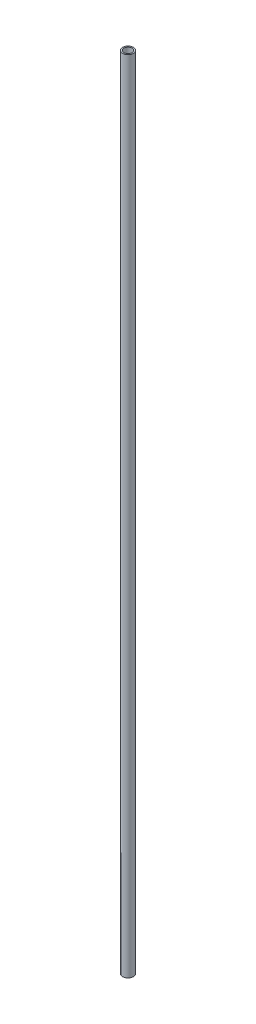
ISO-10303-21;
HEADER;
FILE_DESCRIPTION(('STEP AP214'),'2;1');
FILE_NAME('part.step','',(''),(''),'','','');
FILE_SCHEMA(('AUTOMOTIVE_DESIGN { 1 0 10303 214 1 1 1 1 }'));
ENDSEC;
DATA;
#1=APPLICATION_CONTEXT('core data for automotive mechanical design processes');
#2=APPLICATION_PROTOCOL_DEFINITION('international standard','automotive_design',2000,#1);
#3=PRODUCT_CONTEXT('',#1,'mechanical');
#4=PRODUCT('Part','Part','',(#3));
#5=PRODUCT_RELATED_PRODUCT_CATEGORY('part','',(#4));
#6=PRODUCT_DEFINITION_FORMATION('','',#4);
#7=PRODUCT_DEFINITION_CONTEXT('part definition',#1,'design');
#8=PRODUCT_DEFINITION('design','',#6,#7);
#9=PRODUCT_DEFINITION_SHAPE('','',#8);
#10=(LENGTH_UNIT() NAMED_UNIT(*) SI_UNIT(.MILLI.,.METRE.));
#11=(NAMED_UNIT(*) PLANE_ANGLE_UNIT() SI_UNIT($,.RADIAN.));
#12=(NAMED_UNIT(*) SI_UNIT($,.STERADIAN.) SOLID_ANGLE_UNIT());
#13=UNCERTAINTY_MEASURE_WITH_UNIT(LENGTH_MEASURE(1.E-05),#10,'distance_accuracy_value','');
#14=(GEOMETRIC_REPRESENTATION_CONTEXT(3) GLOBAL_UNCERTAINTY_ASSIGNED_CONTEXT((#13)) GLOBAL_UNIT_ASSIGNED_CONTEXT((#10,
#11,#12)) REPRESENTATION_CONTEXT('',''));
#15=CARTESIAN_POINT('',(0.,0.,0.));
#16=DIRECTION('',(0.,0.,1.));
#17=DIRECTION('',(1.,0.,0.));
#18=AXIS2_PLACEMENT_3D('',#15,#16,#17);
#19=CARTESIAN_POINT('',(0.,-300.,0.));
#20=DIRECTION('',(0.,1.,0.));
#21=DIRECTION('',(0.,0.,1.));
#22=AXIS2_PLACEMENT_3D('',#19,#20,#21);
#23=CYLINDRICAL_SURFACE('',#22,4.);
#24=CARTESIAN_POINT('',(0.,-300.,0.));
#25=DIRECTION('',(0.,1.,0.));
#26=DIRECTION('',(0.,0.,1.));
#27=AXIS2_PLACEMENT_3D('',#24,#25,#26);
#28=CIRCLE('',#27,4.);
#29=CARTESIAN_POINT('',(0.,-300.,4.));
#30=VERTEX_POINT('',#29);
#31=EDGE_CURVE('E10',#30,#30,#28,.T.);
#32=ORIENTED_EDGE('',*,*,#31,.T.);
#33=EDGE_LOOP('',(#32));
#34=FACE_BOUND('',#33,.T.);
#35=CARTESIAN_POINT('',(0.,300.,0.));
#36=DIRECTION('',(0.,1.,0.));
#37=DIRECTION('',(0.,0.,1.));
#38=AXIS2_PLACEMENT_3D('',#35,#36,#37);
#39=CIRCLE('',#38,4.);
#40=CARTESIAN_POINT('',(0.,300.,4.));
#41=VERTEX_POINT('',#40);
#42=EDGE_CURVE('E35',#41,#41,#39,.T.);
#43=ORIENTED_EDGE('',*,*,#42,.F.);
#44=EDGE_LOOP('',(#43));
#45=FACE_BOUND('',#44,.T.);
#46=ADVANCED_FACE('F32',(#34,#45),#23,.T.);
#47=CARTESIAN_POINT('',(0.,-300.,0.));
#48=DIRECTION('',(0.,1.,0.));
#49=DIRECTION('',(0.,0.,1.));
#50=AXIS2_PLACEMENT_3D('',#47,#48,#49);
#51=PLANE('',#50);
#52=CARTESIAN_POINT('',(0.,-300.,0.));
#53=DIRECTION('',(0.,1.,0.));
#54=DIRECTION('',(0.,0.,1.));
#55=AXIS2_PLACEMENT_3D('',#52,#53,#54);
#56=CIRCLE('',#55,3.);
#57=CARTESIAN_POINT('',(0.,-300.,3.));
#58=VERTEX_POINT('',#57);
#59=EDGE_CURVE('E42',#58,#58,#56,.T.);
#60=ORIENTED_EDGE('',*,*,#59,.T.);
#61=EDGE_LOOP('',(#60));
#62=FACE_BOUND('',#61,.T.);
#63=ORIENTED_EDGE('',*,*,#31,.F.);
#64=EDGE_LOOP('',(#63));
#65=FACE_BOUND('',#64,.T.);
#66=ADVANCED_FACE('F50',(#62,#65),#51,.F.);
#67=CARTESIAN_POINT('',(0.,300.,0.));
#68=DIRECTION('',(0.,1.,0.));
#69=DIRECTION('',(0.,0.,1.));
#70=AXIS2_PLACEMENT_3D('',#67,#68,#69);
#71=PLANE('',#70);
#72=CARTESIAN_POINT('',(0.,300.,0.));
#73=DIRECTION('',(0.,1.,0.));
#74=DIRECTION('',(0.,0.,1.));
#75=AXIS2_PLACEMENT_3D('',#72,#73,#74);
#76=CIRCLE('',#75,3.);
#77=CARTESIAN_POINT('',(0.,300.,3.));
#78=VERTEX_POINT('',#77);
#79=EDGE_CURVE('E44',#78,#78,#76,.T.);
#80=ORIENTED_EDGE('',*,*,#79,.F.);
#81=EDGE_LOOP('',(#80));
#82=FACE_BOUND('',#81,.T.);
#83=ORIENTED_EDGE('',*,*,#42,.T.);
#84=EDGE_LOOP('',(#83));
#85=FACE_BOUND('',#84,.T.);
#86=ADVANCED_FACE('F56',(#82,#85),#71,.T.);
#87=CARTESIAN_POINT('',(0.,-300.,0.));
#88=DIRECTION('',(0.,1.,0.));
#89=DIRECTION('',(0.,0.,1.));
#90=AXIS2_PLACEMENT_3D('',#87,#88,#89);
#91=CYLINDRICAL_SURFACE('',#90,3.);
#92=ORIENTED_EDGE('',*,*,#59,.F.);
#93=EDGE_LOOP('',(#92));
#94=FACE_BOUND('',#93,.T.);
#95=ORIENTED_EDGE('',*,*,#79,.T.);
#96=EDGE_LOOP('',(#95));
#97=FACE_BOUND('',#96,.T.);
#98=ADVANCED_FACE('F53',(#94,#97),#91,.F.);
#99=CLOSED_SHELL('',(#46,#66,#86,#98));
#100=MANIFOLD_SOLID_BREP('B2',#99);
#101=ADVANCED_BREP_SHAPE_REPRESENTATION('',(#18,#100),#14);
#102=SHAPE_DEFINITION_REPRESENTATION(#9,#101);
ENDSEC;
END-ISO-10303-21;
